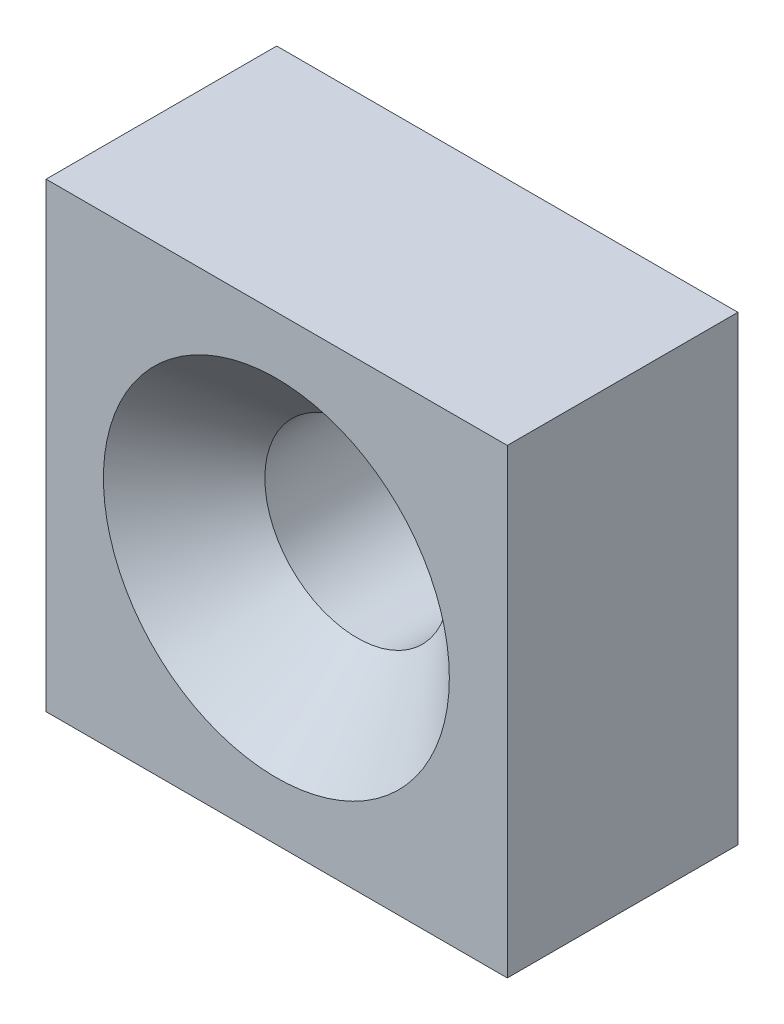
ISO-10303-21;
HEADER;
FILE_DESCRIPTION(('STEP AP214'),'2;1');
FILE_NAME('part.step','',(''),(''),'','','');
FILE_SCHEMA(('AUTOMOTIVE_DESIGN { 1 0 10303 214 1 1 1 1 }'));
ENDSEC;
DATA;
#1=APPLICATION_CONTEXT('core data for automotive mechanical design processes');
#2=APPLICATION_PROTOCOL_DEFINITION('international standard','automotive_design',2000,#1);
#3=PRODUCT_CONTEXT('',#1,'mechanical');
#4=PRODUCT('Part','Part','',(#3));
#5=PRODUCT_RELATED_PRODUCT_CATEGORY('part','',(#4));
#6=PRODUCT_DEFINITION_FORMATION('','',#4);
#7=PRODUCT_DEFINITION_CONTEXT('part definition',#1,'design');
#8=PRODUCT_DEFINITION('design','',#6,#7);
#9=PRODUCT_DEFINITION_SHAPE('','',#8);
#10=(LENGTH_UNIT() NAMED_UNIT(*) SI_UNIT(.MILLI.,.METRE.));
#11=(NAMED_UNIT(*) PLANE_ANGLE_UNIT() SI_UNIT($,.RADIAN.));
#12=(NAMED_UNIT(*) SI_UNIT($,.STERADIAN.) SOLID_ANGLE_UNIT());
#13=UNCERTAINTY_MEASURE_WITH_UNIT(LENGTH_MEASURE(1.E-05),#10,'distance_accuracy_value','');
#14=(GEOMETRIC_REPRESENTATION_CONTEXT(3) GLOBAL_UNCERTAINTY_ASSIGNED_CONTEXT((#13)) GLOBAL_UNIT_ASSIGNED_CONTEXT((#10,
#11,#12)) REPRESENTATION_CONTEXT('',''));
#15=CARTESIAN_POINT('',(0.,0.,0.));
#16=DIRECTION('',(0.,0.,1.));
#17=DIRECTION('',(1.,0.,0.));
#18=AXIS2_PLACEMENT_3D('',#15,#16,#17);
#19=CARTESIAN_POINT('',(0.,0.,10.));
#20=DIRECTION('',(1.,0.,0.));
#21=DIRECTION('',(0.,0.,-1.));
#22=AXIS2_PLACEMENT_3D('',#19,#20,#21);
#23=PLANE('',#22);
#24=DIRECTION('',(0.,-1.,0.));
#25=VECTOR('',#24,1.);
#26=CARTESIAN_POINT('',(0.,0.,0.));
#27=LINE('',#26,#25);
#28=CARTESIAN_POINT('',(0.,20.,0.));
#29=VERTEX_POINT('',#28);
#30=CARTESIAN_POINT('',(0.,0.,0.));
#31=VERTEX_POINT('',#30);
#32=EDGE_CURVE('E105',#29,#31,#27,.T.);
#33=ORIENTED_EDGE('',*,*,#32,.T.);
#34=DIRECTION('',(0.,0.,-1.));
#35=VECTOR('',#34,1.);
#36=CARTESIAN_POINT('',(0.,0.,10.));
#37=LINE('',#36,#35);
#38=CARTESIAN_POINT('',(0.,0.,10.));
#39=VERTEX_POINT('',#38);
#40=EDGE_CURVE('E11',#39,#31,#37,.T.);
#41=ORIENTED_EDGE('',*,*,#40,.F.);
#42=DIRECTION('',(0.,-1.,0.));
#43=VECTOR('',#42,1.);
#44=CARTESIAN_POINT('',(0.,0.,10.));
#45=LINE('',#44,#43);
#46=CARTESIAN_POINT('',(0.,20.,10.));
#47=VERTEX_POINT('',#46);
#48=EDGE_CURVE('E89',#47,#39,#45,.T.);
#49=ORIENTED_EDGE('',*,*,#48,.F.);
#50=DIRECTION('',(0.,0.,-1.));
#51=VECTOR('',#50,1.);
#52=CARTESIAN_POINT('',(0.,20.,10.));
#53=LINE('',#52,#51);
#54=EDGE_CURVE('E98',#47,#29,#53,.T.);
#55=ORIENTED_EDGE('',*,*,#54,.T.);
#56=EDGE_LOOP('',(#33,#41,#49,#55));
#57=FACE_BOUND('',#56,.T.);
#58=ADVANCED_FACE('F39',(#57),#23,.F.);
#59=CARTESIAN_POINT('',(0.,0.,10.));
#60=DIRECTION('',(0.,1.,0.));
#61=DIRECTION('',(0.,0.,1.));
#62=AXIS2_PLACEMENT_3D('',#59,#60,#61);
#63=PLANE('',#62);
#64=DIRECTION('',(1.,0.,0.));
#65=VECTOR('',#64,1.);
#66=CARTESIAN_POINT('',(0.,0.,0.));
#67=LINE('',#66,#65);
#68=CARTESIAN_POINT('',(20.,0.,0.));
#69=VERTEX_POINT('',#68);
#70=EDGE_CURVE('E94',#31,#69,#67,.T.);
#71=ORIENTED_EDGE('',*,*,#70,.T.);
#72=DIRECTION('',(0.,0.,-1.));
#73=VECTOR('',#72,1.);
#74=CARTESIAN_POINT('',(20.,0.,10.));
#75=LINE('',#74,#73);
#76=CARTESIAN_POINT('',(20.,0.,10.));
#77=VERTEX_POINT('',#76);
#78=EDGE_CURVE('E50',#77,#69,#75,.T.);
#79=ORIENTED_EDGE('',*,*,#78,.F.);
#80=DIRECTION('',(1.,0.,0.));
#81=VECTOR('',#80,1.);
#82=CARTESIAN_POINT('',(0.,0.,10.));
#83=LINE('',#82,#81);
#84=EDGE_CURVE('E85',#39,#77,#83,.T.);
#85=ORIENTED_EDGE('',*,*,#84,.F.);
#86=ORIENTED_EDGE('',*,*,#40,.T.);
#87=EDGE_LOOP('',(#71,#79,#85,#86));
#88=FACE_BOUND('',#87,.T.);
#89=ADVANCED_FACE('F91',(#88),#63,.F.);
#90=CARTESIAN_POINT('',(20.,0.,10.));
#91=DIRECTION('',(-1.,0.,0.));
#92=DIRECTION('',(0.,0.,1.));
#93=AXIS2_PLACEMENT_3D('',#90,#91,#92);
#94=PLANE('',#93);
#95=DIRECTION('',(0.,1.,0.));
#96=VECTOR('',#95,1.);
#97=CARTESIAN_POINT('',(20.,0.,0.));
#98=LINE('',#97,#96);
#99=CARTESIAN_POINT('',(20.,20.,0.));
#100=VERTEX_POINT('',#99);
#101=EDGE_CURVE('E75',#69,#100,#98,.T.);
#102=ORIENTED_EDGE('',*,*,#101,.T.);
#103=DIRECTION('',(0.,0.,-1.));
#104=VECTOR('',#103,1.);
#105=CARTESIAN_POINT('',(20.,20.,10.));
#106=LINE('',#105,#104);
#107=CARTESIAN_POINT('',(20.,20.,10.));
#108=VERTEX_POINT('',#107);
#109=EDGE_CURVE('E92',#108,#100,#106,.T.);
#110=ORIENTED_EDGE('',*,*,#109,.F.);
#111=DIRECTION('',(0.,1.,0.));
#112=VECTOR('',#111,1.);
#113=CARTESIAN_POINT('',(20.,0.,10.));
#114=LINE('',#113,#112);
#115=EDGE_CURVE('E86',#77,#108,#114,.T.);
#116=ORIENTED_EDGE('',*,*,#115,.F.);
#117=ORIENTED_EDGE('',*,*,#78,.T.);
#118=EDGE_LOOP('',(#102,#110,#116,#117));
#119=FACE_BOUND('',#118,.T.);
#120=ADVANCED_FACE('F96',(#119),#94,.F.);
#121=CARTESIAN_POINT('',(0.,20.,10.));
#122=DIRECTION('',(0.,-1.,0.));
#123=DIRECTION('',(0.,0.,-1.));
#124=AXIS2_PLACEMENT_3D('',#121,#122,#123);
#125=PLANE('',#124);
#126=DIRECTION('',(-1.,0.,0.));
#127=VECTOR('',#126,1.);
#128=CARTESIAN_POINT('',(0.,20.,0.));
#129=LINE('',#128,#127);
#130=EDGE_CURVE('E77',#100,#29,#129,.T.);
#131=ORIENTED_EDGE('',*,*,#130,.T.);
#132=ORIENTED_EDGE('',*,*,#54,.F.);
#133=DIRECTION('',(-1.,0.,0.));
#134=VECTOR('',#133,1.);
#135=CARTESIAN_POINT('',(0.,20.,10.));
#136=LINE('',#135,#134);
#137=EDGE_CURVE('E54',#108,#47,#136,.T.);
#138=ORIENTED_EDGE('',*,*,#137,.F.);
#139=ORIENTED_EDGE('',*,*,#109,.T.);
#140=EDGE_LOOP('',(#131,#132,#138,#139));
#141=FACE_BOUND('',#140,.T.);
#142=ADVANCED_FACE('F109',(#141),#125,.F.);
#143=CARTESIAN_POINT('',(0.,0.,10.));
#144=DIRECTION('',(0.,0.,-1.));
#145=DIRECTION('',(-1.,0.,0.));
#146=AXIS2_PLACEMENT_3D('',#143,#144,#145);
#147=PLANE('',#146);
#148=CARTESIAN_POINT('',(9.98648737498797,10.0143055988724,10.));
#149=DIRECTION('',(0.,0.,1.));
#150=DIRECTION('',(1.,0.,0.));
#151=AXIS2_PLACEMENT_3D('',#148,#149,#150);
#152=CIRCLE('',#151,7.5);
#153=CARTESIAN_POINT('',(17.486487374988,10.0143055988724,10.));
#154=VERTEX_POINT('',#153);
#155=EDGE_CURVE('E121',#154,#154,#152,.T.);
#156=ORIENTED_EDGE('',*,*,#155,.F.);
#157=EDGE_LOOP('',(#156));
#158=FACE_BOUND('',#157,.T.);
#159=ORIENTED_EDGE('',*,*,#48,.T.);
#160=ORIENTED_EDGE('',*,*,#84,.T.);
#161=ORIENTED_EDGE('',*,*,#115,.T.);
#162=ORIENTED_EDGE('',*,*,#137,.T.);
#163=EDGE_LOOP('',(#159,#160,#161,#162));
#164=FACE_BOUND('',#163,.T.);
#165=ADVANCED_FACE('F88',(#158,#164),#147,.F.);
#166=CARTESIAN_POINT('',(0.,0.,0.));
#167=DIRECTION('',(0.,0.,-1.));
#168=DIRECTION('',(-1.,0.,0.));
#169=AXIS2_PLACEMENT_3D('',#166,#167,#168);
#170=PLANE('',#169);
#171=CARTESIAN_POINT('',(9.98648737498797,10.0143055988724,0.));
#172=DIRECTION('',(0.,0.,1.));
#173=DIRECTION('',(1.,0.,0.));
#174=AXIS2_PLACEMENT_3D('',#171,#172,#173);
#175=CIRCLE('',#174,3.99999999999999);
#176=CARTESIAN_POINT('',(13.986487374988,10.0143055988724,0.));
#177=VERTEX_POINT('',#176);
#178=EDGE_CURVE('E104',#177,#177,#175,.T.);
#179=ORIENTED_EDGE('',*,*,#178,.T.);
#180=EDGE_LOOP('',(#179));
#181=FACE_BOUND('',#180,.T.);
#182=ORIENTED_EDGE('',*,*,#32,.F.);
#183=ORIENTED_EDGE('',*,*,#130,.F.);
#184=ORIENTED_EDGE('',*,*,#101,.F.);
#185=ORIENTED_EDGE('',*,*,#70,.F.);
#186=EDGE_LOOP('',(#182,#183,#184,#185));
#187=FACE_BOUND('',#186,.T.);
#188=ADVANCED_FACE('F114',(#181,#187),#170,.T.);
#189=CARTESIAN_POINT('',(9.98648737498797,10.0143055988724,10.));
#190=DIRECTION('',(0.,0.,1.));
#191=DIRECTION('',(1.,0.,0.));
#192=AXIS2_PLACEMENT_3D('',#189,#190,#191);
#193=CYLINDRICAL_SURFACE('',#192,3.99999999999999);
#194=ORIENTED_EDGE('',*,*,#178,.F.);
#195=EDGE_LOOP('',(#194));
#196=FACE_BOUND('',#195,.T.);
#197=CARTESIAN_POINT('',(9.98648737498797,10.0143055988724,6.49999999999997));
#198=DIRECTION('',(0.,0.,1.));
#199=DIRECTION('',(1.,0.,0.));
#200=AXIS2_PLACEMENT_3D('',#197,#198,#199);
#201=CIRCLE('',#200,3.99999999999999);
#202=CARTESIAN_POINT('',(13.986487374988,10.0143055988724,6.49999999999997));
#203=VERTEX_POINT('',#202);
#204=EDGE_CURVE('E117',#203,#203,#201,.T.);
#205=ORIENTED_EDGE('',*,*,#204,.T.);
#206=EDGE_LOOP('',(#205));
#207=FACE_BOUND('',#206,.T.);
#208=ADVANCED_FACE('F132',(#196,#207),#193,.F.);
#209=CARTESIAN_POINT('',(9.98648737498797,10.0143055988724,10.));
#210=DIRECTION('',(0.,0.,1.));
#211=DIRECTION('',(1.,0.,0.));
#212=AXIS2_PLACEMENT_3D('',#209,#210,#211);
#213=CONICAL_SURFACE('',#212,7.5,0.785398163397445);
#214=ORIENTED_EDGE('',*,*,#204,.F.);
#215=EDGE_LOOP('',(#214));
#216=FACE_BOUND('',#215,.T.);
#217=ORIENTED_EDGE('',*,*,#155,.T.);
#218=EDGE_LOOP('',(#217));
#219=FACE_BOUND('',#218,.T.);
#220=ADVANCED_FACE('F125',(#216,#219),#213,.F.);
#221=CLOSED_SHELL('',(#58,#89,#120,#142,#165,#188,#208,#220));
#222=MANIFOLD_SOLID_BREP('B2',#221);
#223=ADVANCED_BREP_SHAPE_REPRESENTATION('',(#18,#222),#14);
#224=SHAPE_DEFINITION_REPRESENTATION(#9,#223);
ENDSEC;
END-ISO-10303-21;
